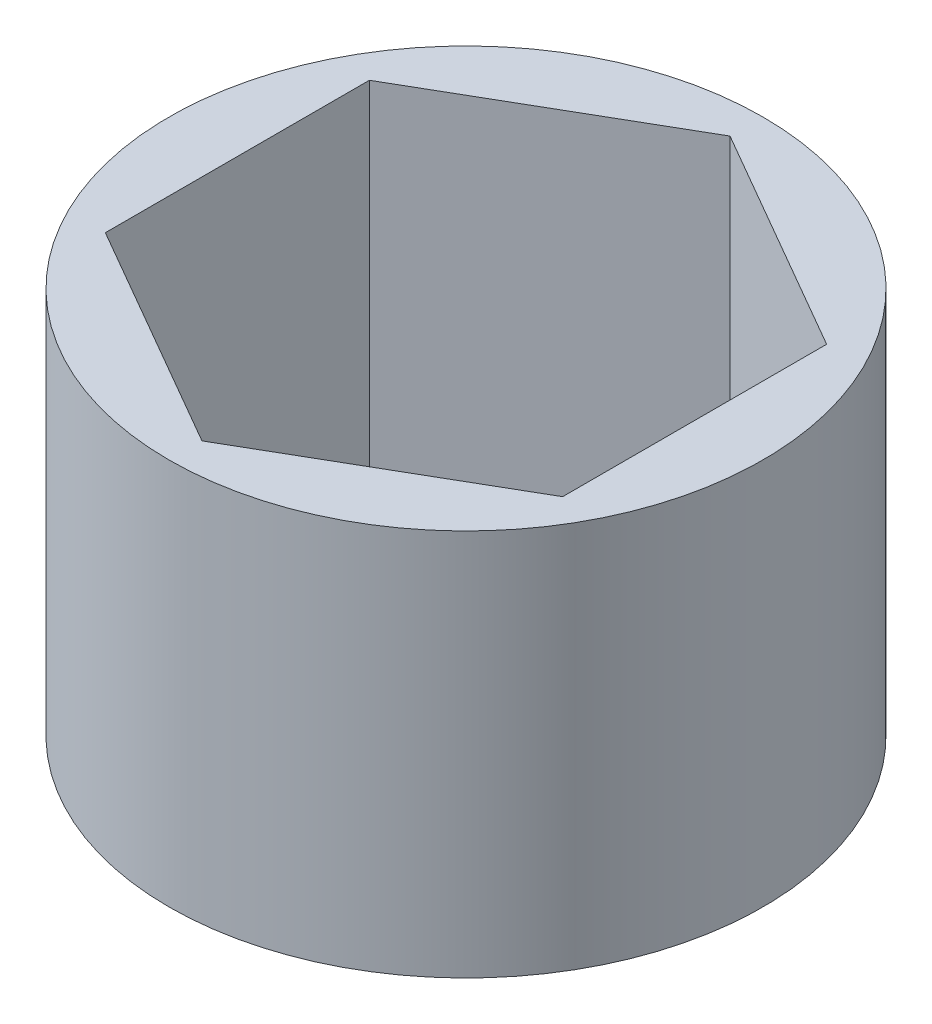
ISO-10303-21;
HEADER;
FILE_DESCRIPTION(('STEP AP214'),'2;1');
FILE_NAME('part.step','',(''),(''),'','','');
FILE_SCHEMA(('AUTOMOTIVE_DESIGN { 1 0 10303 214 1 1 1 1 }'));
ENDSEC;
DATA;
#1=APPLICATION_CONTEXT('core data for automotive mechanical design processes');
#2=APPLICATION_PROTOCOL_DEFINITION('international standard','automotive_design',2000,#1);
#3=PRODUCT_CONTEXT('',#1,'mechanical');
#4=PRODUCT('Part','Part','',(#3));
#5=PRODUCT_RELATED_PRODUCT_CATEGORY('part','',(#4));
#6=PRODUCT_DEFINITION_FORMATION('','',#4);
#7=PRODUCT_DEFINITION_CONTEXT('part definition',#1,'design');
#8=PRODUCT_DEFINITION('design','',#6,#7);
#9=PRODUCT_DEFINITION_SHAPE('','',#8);
#10=(LENGTH_UNIT() NAMED_UNIT(*) SI_UNIT(.MILLI.,.METRE.));
#11=(NAMED_UNIT(*) PLANE_ANGLE_UNIT() SI_UNIT($,.RADIAN.));
#12=(NAMED_UNIT(*) SI_UNIT($,.STERADIAN.) SOLID_ANGLE_UNIT());
#13=UNCERTAINTY_MEASURE_WITH_UNIT(LENGTH_MEASURE(1.E-05),#10,'distance_accuracy_value','');
#14=(GEOMETRIC_REPRESENTATION_CONTEXT(3) GLOBAL_UNCERTAINTY_ASSIGNED_CONTEXT((#13)) GLOBAL_UNIT_ASSIGNED_CONTEXT((#10,
#11,#12)) REPRESENTATION_CONTEXT('',''));
#15=CARTESIAN_POINT('',(0.,0.,0.));
#16=DIRECTION('',(0.,0.,1.));
#17=DIRECTION('',(1.,0.,0.));
#18=AXIS2_PLACEMENT_3D('',#15,#16,#17);
#19=CARTESIAN_POINT('',(0.,11.43,0.));
#20=DIRECTION('',(0.,1.,0.));
#21=DIRECTION('',(0.,0.,1.));
#22=AXIS2_PLACEMENT_3D('',#19,#20,#21);
#23=PLANE('',#22);
#24=CARTESIAN_POINT('',(0.,11.43,0.));
#25=DIRECTION('',(0.,1.,0.));
#26=DIRECTION('',(0.,0.,1.));
#27=AXIS2_PLACEMENT_3D('',#24,#25,#26);
#28=CIRCLE('',#27,8.76881679389313);
#29=CARTESIAN_POINT('',(0.,11.43,8.76881679389313));
#30=VERTEX_POINT('',#29);
#31=EDGE_CURVE('E11',#30,#30,#28,.T.);
#32=ORIENTED_EDGE('',*,*,#31,.T.);
#33=EDGE_LOOP('',(#32));
#34=FACE_BOUND('',#33,.T.);
#35=DIRECTION('',(-0.866025403784439,0.,0.5));
#36=VECTOR('',#35,1.);
#37=CARTESIAN_POINT('',(0.,11.43,-7.79422863405995));
#38=LINE('',#37,#36);
#39=CARTESIAN_POINT('',(0.,11.43,-7.79422863405995));
#40=VERTEX_POINT('',#39);
#41=CARTESIAN_POINT('',(-6.75,11.43,-3.89711431702997));
#42=VERTEX_POINT('',#41);
#43=EDGE_CURVE('E94',#40,#42,#38,.T.);
#44=ORIENTED_EDGE('',*,*,#43,.F.);
#45=DIRECTION('',(-0.866025403784439,0.,-0.5));
#46=VECTOR('',#45,1.);
#47=CARTESIAN_POINT('',(6.75,11.43,-3.89711431702997));
#48=LINE('',#47,#46);
#49=CARTESIAN_POINT('',(6.75,11.43,-3.89711431702997));
#50=VERTEX_POINT('',#49);
#51=EDGE_CURVE('E86',#50,#40,#48,.T.);
#52=ORIENTED_EDGE('',*,*,#51,.F.);
#53=DIRECTION('',(0.,0.,-1.));
#54=VECTOR('',#53,1.);
#55=CARTESIAN_POINT('',(6.75,11.43,3.89711431702997));
#56=LINE('',#55,#54);
#57=CARTESIAN_POINT('',(6.75,11.43,3.89711431702997));
#58=VERTEX_POINT('',#57);
#59=EDGE_CURVE('E114',#58,#50,#56,.T.);
#60=ORIENTED_EDGE('',*,*,#59,.F.);
#61=DIRECTION('',(0.866025403784439,0.,-0.5));
#62=VECTOR('',#61,1.);
#63=CARTESIAN_POINT('',(0.,11.43,7.79422863405995));
#64=LINE('',#63,#62);
#65=CARTESIAN_POINT('',(0.,11.43,7.79422863405995));
#66=VERTEX_POINT('',#65);
#67=EDGE_CURVE('E112',#66,#58,#64,.T.);
#68=ORIENTED_EDGE('',*,*,#67,.F.);
#69=DIRECTION('',(0.866025403784439,0.,0.5));
#70=VECTOR('',#69,1.);
#71=CARTESIAN_POINT('',(-6.75,11.43,3.89711431702997));
#72=LINE('',#71,#70);
#73=CARTESIAN_POINT('',(-6.75,11.43,3.89711431702997));
#74=VERTEX_POINT('',#73);
#75=EDGE_CURVE('E108',#74,#66,#72,.T.);
#76=ORIENTED_EDGE('',*,*,#75,.F.);
#77=DIRECTION('',(0.,0.,1.));
#78=VECTOR('',#77,1.);
#79=CARTESIAN_POINT('',(-6.75,11.43,-3.89711431702997));
#80=LINE('',#79,#78);
#81=EDGE_CURVE('E106',#42,#74,#80,.T.);
#82=ORIENTED_EDGE('',*,*,#81,.F.);
#83=EDGE_LOOP('',(#44,#52,#60,#68,#76,#82));
#84=FACE_BOUND('',#83,.T.);
#85=ADVANCED_FACE('F33',(#34,#84),#23,.T.);
#86=CARTESIAN_POINT('',(0.,0.,0.));
#87=DIRECTION('',(0.,1.,0.));
#88=DIRECTION('',(0.,0.,1.));
#89=AXIS2_PLACEMENT_3D('',#86,#87,#88);
#90=PLANE('',#89);
#91=CARTESIAN_POINT('',(0.,0.,0.));
#92=DIRECTION('',(0.,1.,0.));
#93=DIRECTION('',(0.,0.,1.));
#94=AXIS2_PLACEMENT_3D('',#91,#92,#93);
#95=CIRCLE('',#94,8.76881679389313);
#96=CARTESIAN_POINT('',(0.,0.,8.76881679389313));
#97=VERTEX_POINT('',#96);
#98=EDGE_CURVE('E37',#97,#97,#95,.T.);
#99=ORIENTED_EDGE('',*,*,#98,.F.);
#100=EDGE_LOOP('',(#99));
#101=FACE_BOUND('',#100,.T.);
#102=DIRECTION('',(-0.866025403784439,0.,-0.5));
#103=VECTOR('',#102,1.);
#104=CARTESIAN_POINT('',(6.75,0.,-3.89711431702997));
#105=LINE('',#104,#103);
#106=CARTESIAN_POINT('',(6.75,0.,-3.89711431702997));
#107=VERTEX_POINT('',#106);
#108=CARTESIAN_POINT('',(0.,0.,-7.79422863405995));
#109=VERTEX_POINT('',#108);
#110=EDGE_CURVE('E56',#107,#109,#105,.T.);
#111=ORIENTED_EDGE('',*,*,#110,.T.);
#112=DIRECTION('',(-0.866025403784439,0.,0.5));
#113=VECTOR('',#112,1.);
#114=CARTESIAN_POINT('',(0.,0.,-7.79422863405995));
#115=LINE('',#114,#113);
#116=CARTESIAN_POINT('',(-6.75,0.,-3.89711431702997));
#117=VERTEX_POINT('',#116);
#118=EDGE_CURVE('E101',#109,#117,#115,.T.);
#119=ORIENTED_EDGE('',*,*,#118,.T.);
#120=DIRECTION('',(0.,0.,1.));
#121=VECTOR('',#120,1.);
#122=CARTESIAN_POINT('',(-6.75,0.,-3.89711431702997));
#123=LINE('',#122,#121);
#124=CARTESIAN_POINT('',(-6.75,0.,3.89711431702997));
#125=VERTEX_POINT('',#124);
#126=EDGE_CURVE('E118',#117,#125,#123,.T.);
#127=ORIENTED_EDGE('',*,*,#126,.T.);
#128=DIRECTION('',(0.866025403784439,0.,0.5));
#129=VECTOR('',#128,1.);
#130=CARTESIAN_POINT('',(-6.75,0.,3.89711431702997));
#131=LINE('',#130,#129);
#132=CARTESIAN_POINT('',(0.,0.,7.79422863405995));
#133=VERTEX_POINT('',#132);
#134=EDGE_CURVE('E121',#125,#133,#131,.T.);
#135=ORIENTED_EDGE('',*,*,#134,.T.);
#136=DIRECTION('',(0.866025403784439,0.,-0.5));
#137=VECTOR('',#136,1.);
#138=CARTESIAN_POINT('',(0.,0.,7.79422863405995));
#139=LINE('',#138,#137);
#140=CARTESIAN_POINT('',(6.75,0.,3.89711431702997));
#141=VERTEX_POINT('',#140);
#142=EDGE_CURVE('E124',#133,#141,#139,.T.);
#143=ORIENTED_EDGE('',*,*,#142,.T.);
#144=DIRECTION('',(0.,0.,-1.));
#145=VECTOR('',#144,1.);
#146=CARTESIAN_POINT('',(6.75,0.,3.89711431702997));
#147=LINE('',#146,#145);
#148=EDGE_CURVE('E95',#141,#107,#147,.T.);
#149=ORIENTED_EDGE('',*,*,#148,.T.);
#150=EDGE_LOOP('',(#111,#119,#127,#135,#143,#149));
#151=FACE_BOUND('',#150,.T.);
#152=ADVANCED_FACE('F141',(#101,#151),#90,.F.);
#153=CARTESIAN_POINT('',(0.,11.43,0.));
#154=DIRECTION('',(0.,-1.,0.));
#155=DIRECTION('',(0.,0.,-1.));
#156=AXIS2_PLACEMENT_3D('',#153,#154,#155);
#157=CYLINDRICAL_SURFACE('',#156,8.76881679389313);
#158=ORIENTED_EDGE('',*,*,#31,.F.);
#159=EDGE_LOOP('',(#158));
#160=FACE_BOUND('',#159,.T.);
#161=ORIENTED_EDGE('',*,*,#98,.T.);
#162=EDGE_LOOP('',(#161));
#163=FACE_BOUND('',#162,.T.);
#164=ADVANCED_FACE('F35',(#160,#163),#157,.T.);
#165=CARTESIAN_POINT('',(6.75,11.43,-3.89711431702997));
#166=DIRECTION('',(-0.5,0.,0.866025403784439));
#167=DIRECTION('',(0.866025403784439,0.,0.5));
#168=AXIS2_PLACEMENT_3D('',#165,#166,#167);
#169=PLANE('',#168);
#170=ORIENTED_EDGE('',*,*,#110,.F.);
#171=DIRECTION('',(0.,-1.,0.));
#172=VECTOR('',#171,1.);
#173=CARTESIAN_POINT('',(6.75,11.43,-3.89711431702997));
#174=LINE('',#173,#172);
#175=EDGE_CURVE('E90',#50,#107,#174,.T.);
#176=ORIENTED_EDGE('',*,*,#175,.F.);
#177=ORIENTED_EDGE('',*,*,#51,.T.);
#178=DIRECTION('',(0.,-1.,0.));
#179=VECTOR('',#178,1.);
#180=CARTESIAN_POINT('',(0.,11.43,-7.79422863405995));
#181=LINE('',#180,#179);
#182=EDGE_CURVE('E89',#40,#109,#181,.T.);
#183=ORIENTED_EDGE('',*,*,#182,.T.);
#184=EDGE_LOOP('',(#170,#176,#177,#183));
#185=FACE_BOUND('',#184,.T.);
#186=ADVANCED_FACE('F88',(#185),#169,.T.);
#187=CARTESIAN_POINT('',(0.,11.43,-7.79422863405995));
#188=DIRECTION('',(0.5,0.,0.866025403784439));
#189=DIRECTION('',(0.866025403784439,0.,-0.5));
#190=AXIS2_PLACEMENT_3D('',#187,#188,#189);
#191=PLANE('',#190);
#192=ORIENTED_EDGE('',*,*,#118,.F.);
#193=ORIENTED_EDGE('',*,*,#182,.F.);
#194=ORIENTED_EDGE('',*,*,#43,.T.);
#195=DIRECTION('',(0.,-1.,0.));
#196=VECTOR('',#195,1.);
#197=CARTESIAN_POINT('',(-6.75,11.43,-3.89711431702997));
#198=LINE('',#197,#196);
#199=EDGE_CURVE('E102',#42,#117,#198,.T.);
#200=ORIENTED_EDGE('',*,*,#199,.T.);
#201=EDGE_LOOP('',(#192,#193,#194,#200));
#202=FACE_BOUND('',#201,.T.);
#203=ADVANCED_FACE('F98',(#202),#191,.T.);
#204=CARTESIAN_POINT('',(-6.75,11.43,-3.89711431702997));
#205=DIRECTION('',(1.,0.,0.));
#206=DIRECTION('',(0.,0.,-1.));
#207=AXIS2_PLACEMENT_3D('',#204,#205,#206);
#208=PLANE('',#207);
#209=ORIENTED_EDGE('',*,*,#126,.F.);
#210=ORIENTED_EDGE('',*,*,#199,.F.);
#211=ORIENTED_EDGE('',*,*,#81,.T.);
#212=DIRECTION('',(0.,-1.,0.));
#213=VECTOR('',#212,1.);
#214=CARTESIAN_POINT('',(-6.75,11.43,3.89711431702997));
#215=LINE('',#214,#213);
#216=EDGE_CURVE('E133',#74,#125,#215,.T.);
#217=ORIENTED_EDGE('',*,*,#216,.T.);
#218=EDGE_LOOP('',(#209,#210,#211,#217));
#219=FACE_BOUND('',#218,.T.);
#220=ADVANCED_FACE('F137',(#219),#208,.T.);
#221=CARTESIAN_POINT('',(-6.75,11.43,3.89711431702997));
#222=DIRECTION('',(0.5,0.,-0.866025403784439));
#223=DIRECTION('',(-0.866025403784439,0.,-0.5));
#224=AXIS2_PLACEMENT_3D('',#221,#222,#223);
#225=PLANE('',#224);
#226=ORIENTED_EDGE('',*,*,#134,.F.);
#227=ORIENTED_EDGE('',*,*,#216,.F.);
#228=ORIENTED_EDGE('',*,*,#75,.T.);
#229=DIRECTION('',(0.,-1.,0.));
#230=VECTOR('',#229,1.);
#231=CARTESIAN_POINT('',(0.,11.43,7.79422863405995));
#232=LINE('',#231,#230);
#233=EDGE_CURVE('E131',#66,#133,#232,.T.);
#234=ORIENTED_EDGE('',*,*,#233,.T.);
#235=EDGE_LOOP('',(#226,#227,#228,#234));
#236=FACE_BOUND('',#235,.T.);
#237=ADVANCED_FACE('F149',(#236),#225,.T.);
#238=CARTESIAN_POINT('',(0.,11.43,7.79422863405995));
#239=DIRECTION('',(-0.5,0.,-0.866025403784439));
#240=DIRECTION('',(-0.866025403784439,0.,0.5));
#241=AXIS2_PLACEMENT_3D('',#238,#239,#240);
#242=PLANE('',#241);
#243=ORIENTED_EDGE('',*,*,#142,.F.);
#244=ORIENTED_EDGE('',*,*,#233,.F.);
#245=ORIENTED_EDGE('',*,*,#67,.T.);
#246=DIRECTION('',(0.,-1.,0.));
#247=VECTOR('',#246,1.);
#248=CARTESIAN_POINT('',(6.75,11.43,3.89711431702997));
#249=LINE('',#248,#247);
#250=EDGE_CURVE('E48',#58,#141,#249,.T.);
#251=ORIENTED_EDGE('',*,*,#250,.T.);
#252=EDGE_LOOP('',(#243,#244,#245,#251));
#253=FACE_BOUND('',#252,.T.);
#254=ADVANCED_FACE('F147',(#253),#242,.T.);
#255=CARTESIAN_POINT('',(6.75,11.43,3.89711431702997));
#256=DIRECTION('',(-1.,0.,0.));
#257=DIRECTION('',(0.,0.,1.));
#258=AXIS2_PLACEMENT_3D('',#255,#256,#257);
#259=PLANE('',#258);
#260=ORIENTED_EDGE('',*,*,#148,.F.);
#261=ORIENTED_EDGE('',*,*,#250,.F.);
#262=ORIENTED_EDGE('',*,*,#59,.T.);
#263=ORIENTED_EDGE('',*,*,#175,.T.);
#264=EDGE_LOOP('',(#260,#261,#262,#263));
#265=FACE_BOUND('',#264,.T.);
#266=ADVANCED_FACE('F143',(#265),#259,.T.);
#267=CLOSED_SHELL('',(#85,#152,#164,#186,#203,#220,#237,#254,#266));
#268=MANIFOLD_SOLID_BREP('B2',#267);
#269=ADVANCED_BREP_SHAPE_REPRESENTATION('',(#18,#268),#14);
#270=SHAPE_DEFINITION_REPRESENTATION(#9,#269);
ENDSEC;
END-ISO-10303-21;
